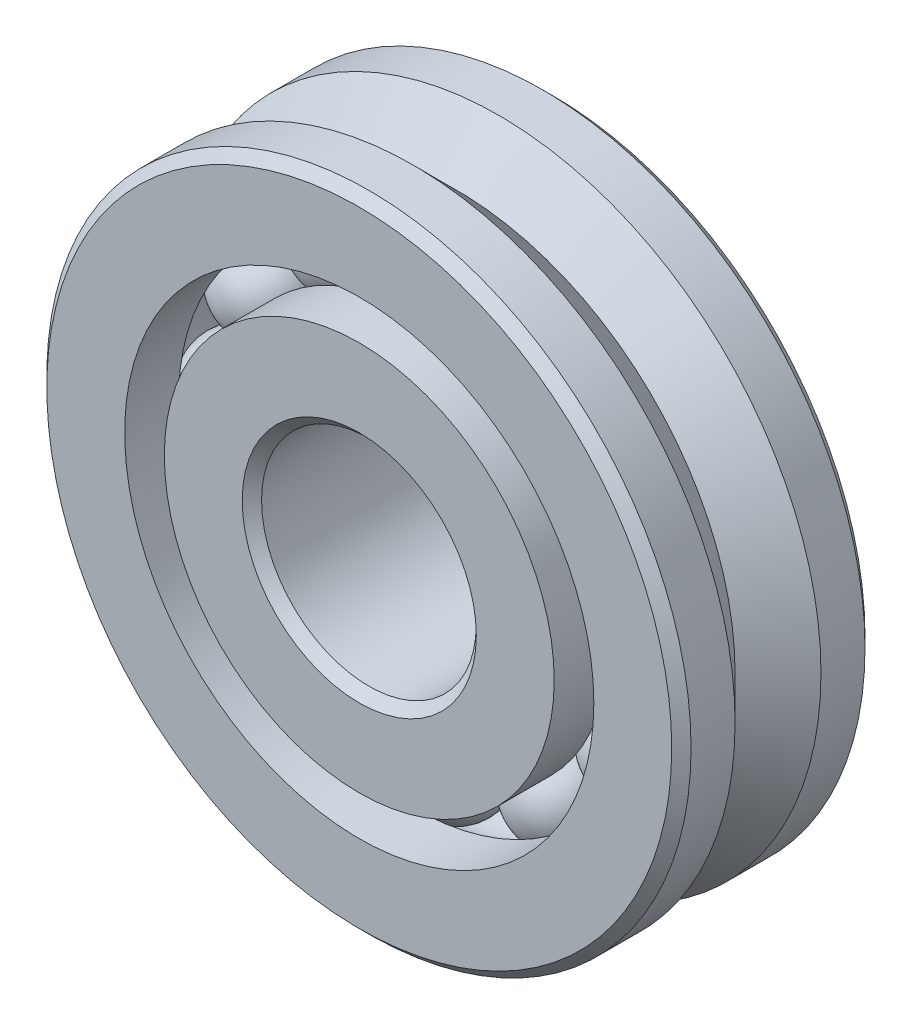
ISO-10303-21;
HEADER;
FILE_DESCRIPTION(('STEP AP214'),'2;1');
FILE_NAME('part.step','',(''),(''),'','','');
FILE_SCHEMA(('AUTOMOTIVE_DESIGN { 1 0 10303 214 1 1 1 1 }'));
ENDSEC;
DATA;
#1=APPLICATION_CONTEXT('core data for automotive mechanical design processes');
#2=APPLICATION_PROTOCOL_DEFINITION('international standard','automotive_design',2000,#1);
#3=PRODUCT_CONTEXT('',#1,'mechanical');
#4=PRODUCT('Part','Part','',(#3));
#5=PRODUCT_RELATED_PRODUCT_CATEGORY('part','',(#4));
#6=PRODUCT_DEFINITION_FORMATION('','',#4);
#7=PRODUCT_DEFINITION_CONTEXT('part definition',#1,'design');
#8=PRODUCT_DEFINITION('design','',#6,#7);
#9=PRODUCT_DEFINITION_SHAPE('','',#8);
#10=(LENGTH_UNIT() NAMED_UNIT(*) SI_UNIT(.MILLI.,.METRE.));
#11=(NAMED_UNIT(*) PLANE_ANGLE_UNIT() SI_UNIT($,.RADIAN.));
#12=(NAMED_UNIT(*) SI_UNIT($,.STERADIAN.) SOLID_ANGLE_UNIT());
#13=UNCERTAINTY_MEASURE_WITH_UNIT(LENGTH_MEASURE(1.E-05),#10,'distance_accuracy_value','');
#14=(GEOMETRIC_REPRESENTATION_CONTEXT(3) GLOBAL_UNCERTAINTY_ASSIGNED_CONTEXT((#13)) GLOBAL_UNIT_ASSIGNED_CONTEXT((#10,
#11,#12)) REPRESENTATION_CONTEXT('',''));
#15=CARTESIAN_POINT('',(0.,0.,0.));
#16=DIRECTION('',(0.,0.,1.));
#17=DIRECTION('',(1.,0.,0.));
#18=AXIS2_PLACEMENT_3D('',#15,#16,#17);
#19=CARTESIAN_POINT('',(-4.99999999999989,8.66025403784445,0.));
#20=DIRECTION('',(0.,0.,1.));
#21=DIRECTION('',(-0.499999999999989,0.866025403784445,0.));
#22=AXIS2_PLACEMENT_3D('',#19,#20,#21);
#23=SPHERICAL_SURFACE('',#22,2.20274170204252);
#24=CARTESIAN_POINT('',(-4.99999999999989,8.66025403784445,2.20274170204251));
#25=VERTEX_POINT('',#24);
#26=VERTEX_LOOP('',#25);
#27=FACE_BOUND('',#26,.T.);
#28=ADVANCED_FACE('F38',(#27),#23,.T.);
#29=CLOSED_SHELL('',(#28));
#30=MANIFOLD_SOLID_BREP('B2',#29);
#31=CARTESIAN_POINT('',(-8.66025403784433,5.0000000000001,0.));
#32=DIRECTION('',(0.,0.,1.));
#33=DIRECTION('',(-0.866025403784433,0.50000000000001,0.));
#34=AXIS2_PLACEMENT_3D('',#31,#32,#33);
#35=SPHERICAL_SURFACE('',#34,2.20274170204252);
#36=CARTESIAN_POINT('',(-8.66025403784433,5.0000000000001,2.20274170204251));
#37=VERTEX_POINT('',#36);
#38=VERTEX_LOOP('',#37);
#39=FACE_BOUND('',#38,.T.);
#40=ADVANCED_FACE('F59',(#39),#35,.T.);
#41=CLOSED_SHELL('',(#40));
#42=MANIFOLD_SOLID_BREP('B6',#41);
#43=CARTESIAN_POINT('',(-10.,1.04744440165294E-13,0.));
#44=DIRECTION('',(0.,0.,1.));
#45=DIRECTION('',(-1.,0.,0.));
#46=AXIS2_PLACEMENT_3D('',#43,#44,#45);
#47=SPHERICAL_SURFACE('',#46,2.20274170204252);
#48=CARTESIAN_POINT('',(-10.,1.04744440165294E-13,2.20274170204251));
#49=VERTEX_POINT('',#48);
#50=VERTEX_LOOP('',#49);
#51=FACE_BOUND('',#50,.T.);
#52=ADVANCED_FACE('F80',(#51),#47,.T.);
#53=CLOSED_SHELL('',(#52));
#54=MANIFOLD_SOLID_BREP('B34',#53);
#55=CARTESIAN_POINT('',(-8.66025403784443,-4.99999999999992,0.));
#56=DIRECTION('',(0.,0.,1.));
#57=DIRECTION('',(-0.866025403784443,-0.499999999999992,0.));
#58=AXIS2_PLACEMENT_3D('',#55,#56,#57);
#59=SPHERICAL_SURFACE('',#58,2.20274170204252);
#60=CARTESIAN_POINT('',(-8.66025403784443,-4.99999999999992,2.20274170204251));
#61=VERTEX_POINT('',#60);
#62=VERTEX_LOOP('',#61);
#63=FACE_BOUND('',#62,.T.);
#64=ADVANCED_FACE('F101',(#63),#59,.T.);
#65=CLOSED_SHELL('',(#64));
#66=MANIFOLD_SOLID_BREP('B55',#65);
#67=CARTESIAN_POINT('',(-5.00000000000007,-8.66025403784434,0.));
#68=DIRECTION('',(0.,0.,1.));
#69=DIRECTION('',(-0.500000000000007,-0.866025403784435,0.));
#70=AXIS2_PLACEMENT_3D('',#67,#68,#69);
#71=SPHERICAL_SURFACE('',#70,2.20274170204252);
#72=CARTESIAN_POINT('',(-5.00000000000007,-8.66025403784434,2.20274170204251));
#73=VERTEX_POINT('',#72);
#74=VERTEX_LOOP('',#73);
#75=FACE_BOUND('',#74,.T.);
#76=ADVANCED_FACE('F122',(#75),#71,.T.);
#77=CLOSED_SHELL('',(#76));
#78=MANIFOLD_SOLID_BREP('B76',#77);
#79=CARTESIAN_POINT('',(0.,-10.,0.));
#80=DIRECTION('',(0.,0.,1.));
#81=DIRECTION('',(0.,-1.,0.));
#82=AXIS2_PLACEMENT_3D('',#79,#80,#81);
#83=SPHERICAL_SURFACE('',#82,2.20274170204252);
#84=CARTESIAN_POINT('',(0.,-10.,2.20274170204251));
#85=VERTEX_POINT('',#84);
#86=VERTEX_LOOP('',#85);
#87=FACE_BOUND('',#86,.T.);
#88=ADVANCED_FACE('F143',(#87),#83,.T.);
#89=CLOSED_SHELL('',(#88));
#90=MANIFOLD_SOLID_BREP('B97',#89);
#91=CARTESIAN_POINT('',(4.99999999999995,-8.66025403784441,0.));
#92=DIRECTION('',(0.,0.,1.));
#93=DIRECTION('',(0.499999999999995,-0.866025403784442,0.));
#94=AXIS2_PLACEMENT_3D('',#91,#92,#93);
#95=SPHERICAL_SURFACE('',#94,2.20274170204252);
#96=CARTESIAN_POINT('',(4.99999999999995,-8.66025403784441,2.20274170204251));
#97=VERTEX_POINT('',#96);
#98=VERTEX_LOOP('',#97);
#99=FACE_BOUND('',#98,.T.);
#100=ADVANCED_FACE('F164',(#99),#95,.T.);
#101=CLOSED_SHELL('',(#100));
#102=MANIFOLD_SOLID_BREP('B118',#101);
#103=CARTESIAN_POINT('',(8.66025403784436,-5.00000000000004,0.));
#104=DIRECTION('',(0.,0.,1.));
#105=DIRECTION('',(0.866025403784436,-0.500000000000004,0.));
#106=AXIS2_PLACEMENT_3D('',#103,#104,#105);
#107=SPHERICAL_SURFACE('',#106,2.20274170204252);
#108=CARTESIAN_POINT('',(8.66025403784436,-5.00000000000004,2.20274170204251));
#109=VERTEX_POINT('',#108);
#110=VERTEX_LOOP('',#109);
#111=FACE_BOUND('',#110,.T.);
#112=ADVANCED_FACE('F185',(#111),#107,.T.);
#113=CLOSED_SHELL('',(#112));
#114=MANIFOLD_SOLID_BREP('B139',#113);
#115=CARTESIAN_POINT('',(10.,0.,0.));
#116=DIRECTION('',(0.,0.,1.));
#117=DIRECTION('',(1.,0.,0.));
#118=AXIS2_PLACEMENT_3D('',#115,#116,#117);
#119=SPHERICAL_SURFACE('',#118,2.20274170204252);
#120=CARTESIAN_POINT('',(10.,0.,2.20274170204251));
#121=VERTEX_POINT('',#120);
#122=VERTEX_LOOP('',#121);
#123=FACE_BOUND('',#122,.T.);
#124=ADVANCED_FACE('F206',(#123),#119,.T.);
#125=CLOSED_SHELL('',(#124));
#126=MANIFOLD_SOLID_BREP('B160',#125);
#127=CARTESIAN_POINT('',(8.6602540378444,4.99999999999998,0.));
#128=DIRECTION('',(0.,0.,1.));
#129=DIRECTION('',(0.86602540378444,0.499999999999998,0.));
#130=AXIS2_PLACEMENT_3D('',#127,#128,#129);
#131=SPHERICAL_SURFACE('',#130,2.20274170204252);
#132=CARTESIAN_POINT('',(8.6602540378444,4.99999999999998,2.20274170204251));
#133=VERTEX_POINT('',#132);
#134=VERTEX_LOOP('',#133);
#135=FACE_BOUND('',#134,.T.);
#136=ADVANCED_FACE('F227',(#135),#131,.T.);
#137=CLOSED_SHELL('',(#136));
#138=MANIFOLD_SOLID_BREP('B181',#137);
#139=CARTESIAN_POINT('',(5.00000000000001,8.66025403784438,0.));
#140=DIRECTION('',(0.,0.,1.));
#141=DIRECTION('',(0.500000000000001,0.866025403784438,0.));
#142=AXIS2_PLACEMENT_3D('',#139,#140,#141);
#143=SPHERICAL_SURFACE('',#142,2.20274170204252);
#144=CARTESIAN_POINT('',(5.00000000000001,8.66025403784438,2.20274170204251));
#145=VERTEX_POINT('',#144);
#146=VERTEX_LOOP('',#145);
#147=FACE_BOUND('',#146,.T.);
#148=ADVANCED_FACE('F248',(#147),#143,.T.);
#149=CLOSED_SHELL('',(#148));
#150=MANIFOLD_SOLID_BREP('B202',#149);
#151=CARTESIAN_POINT('',(0.,10.,0.));
#152=DIRECTION('',(0.,0.,1.));
#153=DIRECTION('',(0.,1.,0.));
#154=AXIS2_PLACEMENT_3D('',#151,#152,#153);
#155=SPHERICAL_SURFACE('',#154,2.20274170204252);
#156=CARTESIAN_POINT('',(0.,10.,2.20274170204251));
#157=VERTEX_POINT('',#156);
#158=VERTEX_LOOP('',#157);
#159=FACE_BOUND('',#158,.T.);
#160=ADVANCED_FACE('F271',(#159),#155,.T.);
#161=CLOSED_SHELL('',(#160));
#162=MANIFOLD_SOLID_BREP('B223',#161);
#163=CARTESIAN_POINT('',(0.,9.07692307692307,4.5));
#164=DIRECTION('',(0.,0.,-1.));
#165=DIRECTION('',(-1.,0.,0.));
#166=AXIS2_PLACEMENT_3D('',#163,#164,#165);
#167=PLANE('',#166);
#168=CARTESIAN_POINT('',(0.,0.,4.5));
#169=DIRECTION('',(0.,0.,1.));
#170=DIRECTION('',(1.,0.,0.));
#171=AXIS2_PLACEMENT_3D('',#168,#169,#170);
#172=CIRCLE('',#171,5.45);
#173=CARTESIAN_POINT('',(5.45,0.,4.5));
#174=VERTEX_POINT('',#173);
#175=EDGE_CURVE('E319',#174,#174,#172,.T.);
#176=ORIENTED_EDGE('',*,*,#175,.F.);
#177=EDGE_LOOP('',(#176));
#178=FACE_BOUND('',#177,.T.);
#179=CARTESIAN_POINT('',(0.,0.,4.5));
#180=DIRECTION('',(0.,0.,1.));
#181=DIRECTION('',(1.,0.,0.));
#182=AXIS2_PLACEMENT_3D('',#179,#180,#181);
#183=CIRCLE('',#182,9.07692307692307);
#184=CARTESIAN_POINT('',(9.07692307692307,0.,4.5));
#185=VERTEX_POINT('',#184);
#186=EDGE_CURVE('E270',#185,#185,#183,.T.);
#187=ORIENTED_EDGE('',*,*,#186,.T.);
#188=EDGE_LOOP('',(#187));
#189=FACE_BOUND('',#188,.T.);
#190=ADVANCED_FACE('F291',(#178,#189),#167,.F.);
#191=CARTESIAN_POINT('',(0.,0.,4.5));
#192=DIRECTION('',(0.,0.,1.));
#193=DIRECTION('',(1.,0.,0.));
#194=AXIS2_PLACEMENT_3D('',#191,#192,#193);
#195=CYLINDRICAL_SURFACE('',#194,9.07692307692307);
#196=ORIENTED_EDGE('',*,*,#186,.F.);
#197=EDGE_LOOP('',(#196));
#198=FACE_BOUND('',#197,.T.);
#199=CARTESIAN_POINT('',(0.,0.,2.));
#200=DIRECTION('',(0.,0.,1.));
#201=DIRECTION('',(1.,0.,0.));
#202=AXIS2_PLACEMENT_3D('',#199,#200,#201);
#203=CIRCLE('',#202,9.07692307692307);
#204=CARTESIAN_POINT('',(9.07692307692307,0.,2.));
#205=VERTEX_POINT('',#204);
#206=EDGE_CURVE('E297',#205,#205,#203,.T.);
#207=ORIENTED_EDGE('',*,*,#206,.T.);
#208=EDGE_LOOP('',(#207));
#209=FACE_BOUND('',#208,.T.);
#210=ADVANCED_FACE('F326',(#198,#209),#195,.T.);
#211=CARTESIAN_POINT('',(0.,0.,0.));
#212=DIRECTION('',(0.,0.,1.));
#213=DIRECTION('',(1.,0.,0.));
#214=AXIS2_PLACEMENT_3D('',#211,#212,#213);
#215=TOROIDAL_SURFACE('',#214,10.,2.20274170204252);
#216=ORIENTED_EDGE('',*,*,#206,.F.);
#217=EDGE_LOOP('',(#216));
#218=FACE_BOUND('',#217,.T.);
#219=CARTESIAN_POINT('',(0.,0.,-2.00000000000001));
#220=DIRECTION('',(0.,0.,1.));
#221=DIRECTION('',(1.,0.,0.));
#222=AXIS2_PLACEMENT_3D('',#219,#220,#221);
#223=CIRCLE('',#222,9.07692307692307);
#224=CARTESIAN_POINT('',(9.07692307692307,0.,-2.00000000000001));
#225=VERTEX_POINT('',#224);
#226=EDGE_CURVE('E301',#225,#225,#223,.T.);
#227=ORIENTED_EDGE('',*,*,#226,.T.);
#228=EDGE_LOOP('',(#227));
#229=FACE_BOUND('',#228,.T.);
#230=ADVANCED_FACE('F330',(#218,#229),#215,.F.);
#231=CARTESIAN_POINT('',(0.,0.,4.5));
#232=DIRECTION('',(0.,0.,1.));
#233=DIRECTION('',(1.,0.,0.));
#234=AXIS2_PLACEMENT_3D('',#231,#232,#233);
#235=CYLINDRICAL_SURFACE('',#234,9.07692307692307);
#236=ORIENTED_EDGE('',*,*,#226,.F.);
#237=EDGE_LOOP('',(#236));
#238=FACE_BOUND('',#237,.T.);
#239=CARTESIAN_POINT('',(0.,0.,-4.5));
#240=DIRECTION('',(0.,0.,1.));
#241=DIRECTION('',(1.,0.,0.));
#242=AXIS2_PLACEMENT_3D('',#239,#240,#241);
#243=CIRCLE('',#242,9.07692307692307);
#244=CARTESIAN_POINT('',(9.07692307692307,0.,-4.5));
#245=VERTEX_POINT('',#244);
#246=EDGE_CURVE('E305',#245,#245,#243,.T.);
#247=ORIENTED_EDGE('',*,*,#246,.T.);
#248=EDGE_LOOP('',(#247));
#249=FACE_BOUND('',#248,.T.);
#250=ADVANCED_FACE('F335',(#238,#249),#235,.T.);
#251=CARTESIAN_POINT('',(0.,5.45,-4.5));
#252=DIRECTION('',(0.,0.,1.));
#253=DIRECTION('',(1.,0.,0.));
#254=AXIS2_PLACEMENT_3D('',#251,#252,#253);
#255=PLANE('',#254);
#256=ORIENTED_EDGE('',*,*,#246,.F.);
#257=EDGE_LOOP('',(#256));
#258=FACE_BOUND('',#257,.T.);
#259=CARTESIAN_POINT('',(0.,0.,-4.5));
#260=DIRECTION('',(0.,0.,1.));
#261=DIRECTION('',(1.,0.,0.));
#262=AXIS2_PLACEMENT_3D('',#259,#260,#261);
#263=CIRCLE('',#262,5.45);
#264=CARTESIAN_POINT('',(5.45,0.,-4.5));
#265=VERTEX_POINT('',#264);
#266=EDGE_CURVE('E310',#265,#265,#263,.T.);
#267=ORIENTED_EDGE('',*,*,#266,.T.);
#268=EDGE_LOOP('',(#267));
#269=FACE_BOUND('',#268,.T.);
#270=ADVANCED_FACE('F341',(#258,#269),#255,.F.);
#271=CARTESIAN_POINT('',(0.,0.,-4.05));
#272=DIRECTION('',(0.,0.,-1.));
#273=DIRECTION('',(-1.,0.,0.));
#274=AXIS2_PLACEMENT_3D('',#271,#272,#273);
#275=CONICAL_SURFACE('',#274,5.,0.785398163397449);
#276=ORIENTED_EDGE('',*,*,#266,.F.);
#277=EDGE_LOOP('',(#276));
#278=FACE_BOUND('',#277,.T.);
#279=CARTESIAN_POINT('',(0.,0.,-4.05));
#280=DIRECTION('',(0.,0.,1.));
#281=DIRECTION('',(1.,0.,0.));
#282=AXIS2_PLACEMENT_3D('',#279,#280,#281);
#283=CIRCLE('',#282,5.);
#284=CARTESIAN_POINT('',(5.,0.,-4.05));
#285=VERTEX_POINT('',#284);
#286=EDGE_CURVE('E313',#285,#285,#283,.T.);
#287=ORIENTED_EDGE('',*,*,#286,.T.);
#288=EDGE_LOOP('',(#287));
#289=FACE_BOUND('',#288,.T.);
#290=ADVANCED_FACE('F345',(#278,#289),#275,.F.);
#291=CARTESIAN_POINT('',(0.,0.,4.5));
#292=DIRECTION('',(0.,0.,1.));
#293=DIRECTION('',(1.,0.,0.));
#294=AXIS2_PLACEMENT_3D('',#291,#292,#293);
#295=CYLINDRICAL_SURFACE('',#294,5.);
#296=ORIENTED_EDGE('',*,*,#286,.F.);
#297=EDGE_LOOP('',(#296));
#298=FACE_BOUND('',#297,.T.);
#299=CARTESIAN_POINT('',(0.,0.,4.05));
#300=DIRECTION('',(0.,0.,1.));
#301=DIRECTION('',(1.,0.,0.));
#302=AXIS2_PLACEMENT_3D('',#299,#300,#301);
#303=CIRCLE('',#302,5.);
#304=CARTESIAN_POINT('',(5.,0.,4.05));
#305=VERTEX_POINT('',#304);
#306=EDGE_CURVE('E316',#305,#305,#303,.T.);
#307=ORIENTED_EDGE('',*,*,#306,.T.);
#308=EDGE_LOOP('',(#307));
#309=FACE_BOUND('',#308,.T.);
#310=ADVANCED_FACE('F349',(#298,#309),#295,.F.);
#311=CARTESIAN_POINT('',(0.,0.,4.5));
#312=DIRECTION('',(0.,0.,1.));
#313=DIRECTION('',(1.,0.,0.));
#314=AXIS2_PLACEMENT_3D('',#311,#312,#313);
#315=CONICAL_SURFACE('',#314,5.45,0.785398163397445);
#316=ORIENTED_EDGE('',*,*,#306,.F.);
#317=EDGE_LOOP('',(#316));
#318=FACE_BOUND('',#317,.T.);
#319=ORIENTED_EDGE('',*,*,#175,.T.);
#320=EDGE_LOOP('',(#319));
#321=FACE_BOUND('',#320,.T.);
#322=ADVANCED_FACE('F323',(#318,#321),#315,.F.);
#323=CLOSED_SHELL('',(#190,#210,#230,#250,#270,#290,#310,#322));
#324=MANIFOLD_SOLID_BREP('B244',#323);
#325=CARTESIAN_POINT('',(0.,0.,4.5));
#326=DIRECTION('',(0.,0.,1.));
#327=DIRECTION('',(1.,0.,0.));
#328=AXIS2_PLACEMENT_3D('',#325,#326,#327);
#329=CYLINDRICAL_SURFACE('',#328,15.);
#330=CARTESIAN_POINT('',(0.,0.,4.05));
#331=DIRECTION('',(0.,0.,1.));
#332=DIRECTION('',(1.,0.,0.));
#333=AXIS2_PLACEMENT_3D('',#330,#331,#332);
#334=CIRCLE('',#333,15.);
#335=CARTESIAN_POINT('',(15.,0.,4.05));
#336=VERTEX_POINT('',#335);
#337=EDGE_CURVE('E450',#336,#336,#334,.T.);
#338=ORIENTED_EDGE('',*,*,#337,.F.);
#339=EDGE_LOOP('',(#338));
#340=FACE_BOUND('',#339,.T.);
#341=CARTESIAN_POINT('',(0.,0.,2.));
#342=DIRECTION('',(0.,0.,1.));
#343=DIRECTION('',(1.,0.,0.));
#344=AXIS2_PLACEMENT_3D('',#341,#342,#343);
#345=CIRCLE('',#344,15.);
#346=CARTESIAN_POINT('',(15.,0.,2.));
#347=VERTEX_POINT('',#346);
#348=EDGE_CURVE('E290',#347,#347,#345,.T.);
#349=ORIENTED_EDGE('',*,*,#348,.T.);
#350=EDGE_LOOP('',(#349));
#351=FACE_BOUND('',#350,.T.);
#352=ADVANCED_FACE('F413',(#340,#351),#329,.T.);
#353=CARTESIAN_POINT('',(0.,0.,0.));
#354=DIRECTION('',(0.,0.,1.));
#355=DIRECTION('',(1.,0.,0.));
#356=AXIS2_PLACEMENT_3D('',#353,#354,#355);
#357=CONICAL_SURFACE('',#356,13.,0.785398163397447);
#358=ORIENTED_EDGE('',*,*,#348,.F.);
#359=EDGE_LOOP('',(#358));
#360=FACE_BOUND('',#359,.T.);
#361=CARTESIAN_POINT('',(0.,0.,0.));
#362=DIRECTION('',(0.,0.,1.));
#363=DIRECTION('',(1.,0.,0.));
#364=AXIS2_PLACEMENT_3D('',#361,#362,#363);
#365=CIRCLE('',#364,13.);
#366=CARTESIAN_POINT('',(13.,0.,0.));
#367=VERTEX_POINT('',#366);
#368=EDGE_CURVE('E419',#367,#367,#365,.T.);
#369=ORIENTED_EDGE('',*,*,#368,.T.);
#370=EDGE_LOOP('',(#369));
#371=FACE_BOUND('',#370,.T.);
#372=ADVANCED_FACE('F457',(#360,#371),#357,.T.);
#373=CARTESIAN_POINT('',(0.,0.,-2.));
#374=DIRECTION('',(0.,0.,-1.));
#375=DIRECTION('',(-1.,0.,0.));
#376=AXIS2_PLACEMENT_3D('',#373,#374,#375);
#377=CONICAL_SURFACE('',#376,15.,0.78539816339745);
#378=ORIENTED_EDGE('',*,*,#368,.F.);
#379=EDGE_LOOP('',(#378));
#380=FACE_BOUND('',#379,.T.);
#381=CARTESIAN_POINT('',(0.,0.,-2.));
#382=DIRECTION('',(0.,0.,1.));
#383=DIRECTION('',(1.,0.,0.));
#384=AXIS2_PLACEMENT_3D('',#381,#382,#383);
#385=CIRCLE('',#384,15.);
#386=CARTESIAN_POINT('',(15.,0.,-2.));
#387=VERTEX_POINT('',#386);
#388=EDGE_CURVE('E423',#387,#387,#385,.T.);
#389=ORIENTED_EDGE('',*,*,#388,.T.);
#390=EDGE_LOOP('',(#389));
#391=FACE_BOUND('',#390,.T.);
#392=ADVANCED_FACE('F461',(#380,#391),#377,.T.);
#393=CARTESIAN_POINT('',(0.,0.,4.5));
#394=DIRECTION('',(0.,0.,1.));
#395=DIRECTION('',(1.,0.,0.));
#396=AXIS2_PLACEMENT_3D('',#393,#394,#395);
#397=CYLINDRICAL_SURFACE('',#396,15.);
#398=ORIENTED_EDGE('',*,*,#388,.F.);
#399=EDGE_LOOP('',(#398));
#400=FACE_BOUND('',#399,.T.);
#401=CARTESIAN_POINT('',(0.,0.,-4.05));
#402=DIRECTION('',(0.,0.,1.));
#403=DIRECTION('',(1.,0.,0.));
#404=AXIS2_PLACEMENT_3D('',#401,#402,#403);
#405=CIRCLE('',#404,15.);
#406=CARTESIAN_POINT('',(15.,0.,-4.05));
#407=VERTEX_POINT('',#406);
#408=EDGE_CURVE('E427',#407,#407,#405,.T.);
#409=ORIENTED_EDGE('',*,*,#408,.T.);
#410=EDGE_LOOP('',(#409));
#411=FACE_BOUND('',#410,.T.);
#412=ADVANCED_FACE('F466',(#400,#411),#397,.T.);
#413=CARTESIAN_POINT('',(0.,0.,-4.5));
#414=DIRECTION('',(0.,0.,1.));
#415=DIRECTION('',(1.,0.,0.));
#416=AXIS2_PLACEMENT_3D('',#413,#414,#415);
#417=CONICAL_SURFACE('',#416,14.55,0.785398163397448);
#418=ORIENTED_EDGE('',*,*,#408,.F.);
#419=EDGE_LOOP('',(#418));
#420=FACE_BOUND('',#419,.T.);
#421=CARTESIAN_POINT('',(0.,0.,-4.5));
#422=DIRECTION('',(0.,0.,1.));
#423=DIRECTION('',(1.,0.,0.));
#424=AXIS2_PLACEMENT_3D('',#421,#422,#423);
#425=CIRCLE('',#424,14.55);
#426=CARTESIAN_POINT('',(14.55,0.,-4.5));
#427=VERTEX_POINT('',#426);
#428=EDGE_CURVE('E432',#427,#427,#425,.T.);
#429=ORIENTED_EDGE('',*,*,#428,.T.);
#430=EDGE_LOOP('',(#429));
#431=FACE_BOUND('',#430,.T.);
#432=ADVANCED_FACE('F472',(#420,#431),#417,.T.);
#433=CARTESIAN_POINT('',(0.,14.55,-4.5));
#434=DIRECTION('',(0.,0.,1.));
#435=DIRECTION('',(1.,0.,0.));
#436=AXIS2_PLACEMENT_3D('',#433,#434,#435);
#437=PLANE('',#436);
#438=ORIENTED_EDGE('',*,*,#428,.F.);
#439=EDGE_LOOP('',(#438));
#440=FACE_BOUND('',#439,.T.);
#441=CARTESIAN_POINT('',(0.,0.,-4.5));
#442=DIRECTION('',(0.,0.,1.));
#443=DIRECTION('',(1.,0.,0.));
#444=AXIS2_PLACEMENT_3D('',#441,#442,#443);
#445=CIRCLE('',#444,10.9230769230769);
#446=CARTESIAN_POINT('',(10.9230769230769,0.,-4.5));
#447=VERTEX_POINT('',#446);
#448=EDGE_CURVE('E435',#447,#447,#445,.T.);
#449=ORIENTED_EDGE('',*,*,#448,.T.);
#450=EDGE_LOOP('',(#449));
#451=FACE_BOUND('',#450,.T.);
#452=ADVANCED_FACE('F476',(#440,#451),#437,.F.);
#453=CARTESIAN_POINT('',(0.,0.,4.5));
#454=DIRECTION('',(0.,0.,1.));
#455=DIRECTION('',(1.,0.,0.));
#456=AXIS2_PLACEMENT_3D('',#453,#454,#455);
#457=CYLINDRICAL_SURFACE('',#456,10.9230769230769);
#458=ORIENTED_EDGE('',*,*,#448,.F.);
#459=EDGE_LOOP('',(#458));
#460=FACE_BOUND('',#459,.T.);
#461=CARTESIAN_POINT('',(0.,0.,-2.));
#462=DIRECTION('',(0.,0.,1.));
#463=DIRECTION('',(1.,0.,0.));
#464=AXIS2_PLACEMENT_3D('',#461,#462,#463);
#465=CIRCLE('',#464,10.9230769230769);
#466=CARTESIAN_POINT('',(10.9230769230769,0.,-2.));
#467=VERTEX_POINT('',#466);
#468=EDGE_CURVE('E438',#467,#467,#465,.T.);
#469=ORIENTED_EDGE('',*,*,#468,.T.);
#470=EDGE_LOOP('',(#469));
#471=FACE_BOUND('',#470,.T.);
#472=ADVANCED_FACE('F480',(#460,#471),#457,.F.);
#473=CARTESIAN_POINT('',(0.,0.,0.));
#474=DIRECTION('',(0.,0.,1.));
#475=DIRECTION('',(1.,0.,0.));
#476=AXIS2_PLACEMENT_3D('',#473,#474,#475);
#477=TOROIDAL_SURFACE('',#476,10.,2.20274170204252);
#478=ORIENTED_EDGE('',*,*,#468,.F.);
#479=EDGE_LOOP('',(#478));
#480=FACE_BOUND('',#479,.T.);
#481=CARTESIAN_POINT('',(0.,0.,2.));
#482=DIRECTION('',(0.,0.,1.));
#483=DIRECTION('',(1.,0.,0.));
#484=AXIS2_PLACEMENT_3D('',#481,#482,#483);
#485=CIRCLE('',#484,10.9230769230769);
#486=CARTESIAN_POINT('',(10.9230769230769,0.,2.));
#487=VERTEX_POINT('',#486);
#488=EDGE_CURVE('E441',#487,#487,#485,.T.);
#489=ORIENTED_EDGE('',*,*,#488,.T.);
#490=EDGE_LOOP('',(#489));
#491=FACE_BOUND('',#490,.T.);
#492=ADVANCED_FACE('F484',(#480,#491),#477,.F.);
#493=CARTESIAN_POINT('',(0.,0.,4.5));
#494=DIRECTION('',(0.,0.,1.));
#495=DIRECTION('',(1.,0.,0.));
#496=AXIS2_PLACEMENT_3D('',#493,#494,#495);
#497=CYLINDRICAL_SURFACE('',#496,10.9230769230769);
#498=ORIENTED_EDGE('',*,*,#488,.F.);
#499=EDGE_LOOP('',(#498));
#500=FACE_BOUND('',#499,.T.);
#501=CARTESIAN_POINT('',(0.,0.,4.5));
#502=DIRECTION('',(0.,0.,1.));
#503=DIRECTION('',(1.,0.,0.));
#504=AXIS2_PLACEMENT_3D('',#501,#502,#503);
#505=CIRCLE('',#504,10.9230769230769);
#506=CARTESIAN_POINT('',(10.9230769230769,0.,4.5));
#507=VERTEX_POINT('',#506);
#508=EDGE_CURVE('E444',#507,#507,#505,.T.);
#509=ORIENTED_EDGE('',*,*,#508,.T.);
#510=EDGE_LOOP('',(#509));
#511=FACE_BOUND('',#510,.T.);
#512=ADVANCED_FACE('F488',(#500,#511),#497,.F.);
#513=CARTESIAN_POINT('',(0.,14.55,4.5));
#514=DIRECTION('',(0.,0.,-1.));
#515=DIRECTION('',(-1.,0.,0.));
#516=AXIS2_PLACEMENT_3D('',#513,#514,#515);
#517=PLANE('',#516);
#518=ORIENTED_EDGE('',*,*,#508,.F.);
#519=EDGE_LOOP('',(#518));
#520=FACE_BOUND('',#519,.T.);
#521=CARTESIAN_POINT('',(0.,0.,4.5));
#522=DIRECTION('',(0.,0.,1.));
#523=DIRECTION('',(1.,0.,0.));
#524=AXIS2_PLACEMENT_3D('',#521,#522,#523);
#525=CIRCLE('',#524,14.55);
#526=CARTESIAN_POINT('',(14.55,0.,4.5));
#527=VERTEX_POINT('',#526);
#528=EDGE_CURVE('E447',#527,#527,#525,.T.);
#529=ORIENTED_EDGE('',*,*,#528,.T.);
#530=EDGE_LOOP('',(#529));
#531=FACE_BOUND('',#530,.T.);
#532=ADVANCED_FACE('F492',(#520,#531),#517,.F.);
#533=CARTESIAN_POINT('',(0.,0.,4.05));
#534=DIRECTION('',(0.,0.,-1.));
#535=DIRECTION('',(-1.,0.,0.));
#536=AXIS2_PLACEMENT_3D('',#533,#534,#535);
#537=CONICAL_SURFACE('',#536,15.,0.785398163397447);
#538=ORIENTED_EDGE('',*,*,#528,.F.);
#539=EDGE_LOOP('',(#538));
#540=FACE_BOUND('',#539,.T.);
#541=ORIENTED_EDGE('',*,*,#337,.T.);
#542=EDGE_LOOP('',(#541));
#543=FACE_BOUND('',#542,.T.);
#544=ADVANCED_FACE('F454',(#540,#543),#537,.T.);
#545=CLOSED_SHELL('',(#352,#372,#392,#412,#432,#452,#472,#492,#512,#532,#544));
#546=MANIFOLD_SOLID_BREP('B265',#545);
#547=ADVANCED_BREP_SHAPE_REPRESENTATION('',(#18,#30,#42,#54,#66,#78,#90,#102,#114,#126,#138,
#150,#162,#324,#546),#14);
#548=SHAPE_DEFINITION_REPRESENTATION(#9,#547);
ENDSEC;
END-ISO-10303-21;
